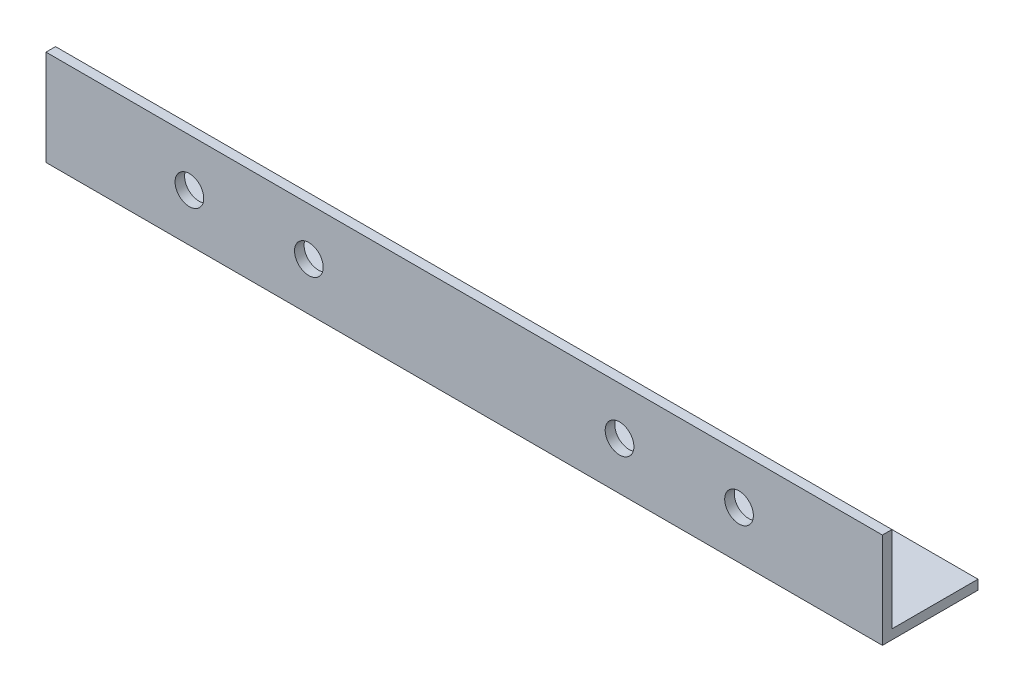
ISO-10303-21;
HEADER;
FILE_DESCRIPTION(('STEP AP214'),'2;1');
FILE_NAME('part.step','',(''),(''),'','','');
FILE_SCHEMA(('AUTOMOTIVE_DESIGN { 1 0 10303 214 1 1 1 1 }'));
ENDSEC;
DATA;
#1=APPLICATION_CONTEXT('core data for automotive mechanical design processes');
#2=APPLICATION_PROTOCOL_DEFINITION('international standard','automotive_design',2000,#1);
#3=PRODUCT_CONTEXT('',#1,'mechanical');
#4=PRODUCT('Part','Part','',(#3));
#5=PRODUCT_RELATED_PRODUCT_CATEGORY('part','',(#4));
#6=PRODUCT_DEFINITION_FORMATION('','',#4);
#7=PRODUCT_DEFINITION_CONTEXT('part definition',#1,'design');
#8=PRODUCT_DEFINITION('design','',#6,#7);
#9=PRODUCT_DEFINITION_SHAPE('','',#8);
#10=(LENGTH_UNIT() NAMED_UNIT(*) SI_UNIT(.MILLI.,.METRE.));
#11=(NAMED_UNIT(*) PLANE_ANGLE_UNIT() SI_UNIT($,.RADIAN.));
#12=(NAMED_UNIT(*) SI_UNIT($,.STERADIAN.) SOLID_ANGLE_UNIT());
#13=UNCERTAINTY_MEASURE_WITH_UNIT(LENGTH_MEASURE(1.E-05),#10,'distance_accuracy_value','');
#14=(GEOMETRIC_REPRESENTATION_CONTEXT(3) GLOBAL_UNCERTAINTY_ASSIGNED_CONTEXT((#13)) GLOBAL_UNIT_ASSIGNED_CONTEXT((#10,
#11,#12)) REPRESENTATION_CONTEXT('',''));
#15=CARTESIAN_POINT('',(0.,0.,0.));
#16=DIRECTION('',(0.,0.,1.));
#17=DIRECTION('',(1.,0.,0.));
#18=AXIS2_PLACEMENT_3D('',#15,#16,#17);
#19=CARTESIAN_POINT('',(350.,0.,-40.));
#20=DIRECTION('',(0.,1.,0.));
#21=DIRECTION('',(0.,0.,1.));
#22=AXIS2_PLACEMENT_3D('',#19,#20,#21);
#23=PLANE('',#22);
#24=DIRECTION('',(0.,0.,-1.));
#25=VECTOR('',#24,1.);
#26=CARTESIAN_POINT('',(0.,0.,-40.));
#27=LINE('',#26,#25);
#28=CARTESIAN_POINT('',(0.,0.,0.));
#29=VERTEX_POINT('',#28);
#30=CARTESIAN_POINT('',(0.,0.,-40.));
#31=VERTEX_POINT('',#30);
#32=EDGE_CURVE('E122',#29,#31,#27,.T.);
#33=ORIENTED_EDGE('',*,*,#32,.T.);
#34=DIRECTION('',(-1.,0.,0.));
#35=VECTOR('',#34,1.);
#36=CARTESIAN_POINT('',(350.,0.,-40.));
#37=LINE('',#36,#35);
#38=CARTESIAN_POINT('',(350.,0.,-40.));
#39=VERTEX_POINT('',#38);
#40=EDGE_CURVE('E11',#39,#31,#37,.T.);
#41=ORIENTED_EDGE('',*,*,#40,.F.);
#42=DIRECTION('',(0.,0.,-1.));
#43=VECTOR('',#42,1.);
#44=CARTESIAN_POINT('',(350.,0.,-40.));
#45=LINE('',#44,#43);
#46=CARTESIAN_POINT('',(350.,0.,0.));
#47=VERTEX_POINT('',#46);
#48=EDGE_CURVE('E133',#47,#39,#45,.T.);
#49=ORIENTED_EDGE('',*,*,#48,.F.);
#50=DIRECTION('',(-1.,0.,0.));
#51=VECTOR('',#50,1.);
#52=CARTESIAN_POINT('',(350.,0.,0.));
#53=LINE('',#52,#51);
#54=EDGE_CURVE('E118',#47,#29,#53,.T.);
#55=ORIENTED_EDGE('',*,*,#54,.T.);
#56=EDGE_LOOP('',(#33,#41,#49,#55));
#57=FACE_BOUND('',#56,.T.);
#58=ADVANCED_FACE('F38',(#57),#23,.F.);
#59=CARTESIAN_POINT('',(350.,4.,-40.));
#60=DIRECTION('',(0.,0.,1.));
#61=DIRECTION('',(1.,0.,0.));
#62=AXIS2_PLACEMENT_3D('',#59,#60,#61);
#63=PLANE('',#62);
#64=DIRECTION('',(0.,1.,0.));
#65=VECTOR('',#64,1.);
#66=CARTESIAN_POINT('',(0.,4.,-40.));
#67=LINE('',#66,#65);
#68=CARTESIAN_POINT('',(0.,4.,-40.));
#69=VERTEX_POINT('',#68);
#70=EDGE_CURVE('E125',#31,#69,#67,.T.);
#71=ORIENTED_EDGE('',*,*,#70,.T.);
#72=DIRECTION('',(-1.,0.,0.));
#73=VECTOR('',#72,1.);
#74=CARTESIAN_POINT('',(350.,4.,-40.));
#75=LINE('',#74,#73);
#76=CARTESIAN_POINT('',(350.,4.,-40.));
#77=VERTEX_POINT('',#76);
#78=EDGE_CURVE('E46',#77,#69,#75,.T.);
#79=ORIENTED_EDGE('',*,*,#78,.F.);
#80=DIRECTION('',(0.,1.,0.));
#81=VECTOR('',#80,1.);
#82=CARTESIAN_POINT('',(350.,4.,-40.));
#83=LINE('',#82,#81);
#84=EDGE_CURVE('E91',#39,#77,#83,.T.);
#85=ORIENTED_EDGE('',*,*,#84,.F.);
#86=ORIENTED_EDGE('',*,*,#40,.T.);
#87=EDGE_LOOP('',(#71,#79,#85,#86));
#88=FACE_BOUND('',#87,.T.);
#89=ADVANCED_FACE('F162',(#88),#63,.F.);
#90=CARTESIAN_POINT('',(350.,4.,-4.));
#91=DIRECTION('',(0.,-1.,0.));
#92=DIRECTION('',(0.,0.,-1.));
#93=AXIS2_PLACEMENT_3D('',#90,#91,#92);
#94=PLANE('',#93);
#95=DIRECTION('',(0.,0.,1.));
#96=VECTOR('',#95,1.);
#97=CARTESIAN_POINT('',(0.,4.,-4.));
#98=LINE('',#97,#96);
#99=CARTESIAN_POINT('',(0.,4.,-4.));
#100=VERTEX_POINT('',#99);
#101=EDGE_CURVE('E128',#69,#100,#98,.T.);
#102=ORIENTED_EDGE('',*,*,#101,.T.);
#103=DIRECTION('',(-1.,0.,0.));
#104=VECTOR('',#103,1.);
#105=CARTESIAN_POINT('',(350.,4.,-4.));
#106=LINE('',#105,#104);
#107=CARTESIAN_POINT('',(350.,4.,-4.));
#108=VERTEX_POINT('',#107);
#109=EDGE_CURVE('E113',#108,#100,#106,.T.);
#110=ORIENTED_EDGE('',*,*,#109,.F.);
#111=DIRECTION('',(0.,0.,1.));
#112=VECTOR('',#111,1.);
#113=CARTESIAN_POINT('',(350.,4.,-4.));
#114=LINE('',#113,#112);
#115=EDGE_CURVE('E104',#77,#108,#114,.T.);
#116=ORIENTED_EDGE('',*,*,#115,.F.);
#117=ORIENTED_EDGE('',*,*,#78,.T.);
#118=EDGE_LOOP('',(#102,#110,#116,#117));
#119=FACE_BOUND('',#118,.T.);
#120=ADVANCED_FACE('F139',(#119),#94,.F.);
#121=CARTESIAN_POINT('',(350.,40.,-4.));
#122=DIRECTION('',(0.,0.,1.));
#123=DIRECTION('',(0.,-1.,0.));
#124=AXIS2_PLACEMENT_3D('',#121,#122,#123);
#125=PLANE('',#124);
#126=CARTESIAN_POINT('',(110.,20.,-4.));
#127=DIRECTION('',(0.,0.,1.));
#128=DIRECTION('',(0.,-1.,0.));
#129=AXIS2_PLACEMENT_3D('',#126,#127,#128);
#130=CIRCLE('',#129,6.);
#131=CARTESIAN_POINT('',(110.,14.,-4.));
#132=VERTEX_POINT('',#131);
#133=EDGE_CURVE('E178',#132,#132,#130,.T.);
#134=ORIENTED_EDGE('',*,*,#133,.T.);
#135=EDGE_LOOP('',(#134));
#136=FACE_BOUND('',#135,.T.);
#137=CARTESIAN_POINT('',(240.,20.,-4.));
#138=DIRECTION('',(0.,0.,1.));
#139=DIRECTION('',(0.,-1.,0.));
#140=AXIS2_PLACEMENT_3D('',#137,#138,#139);
#141=CIRCLE('',#140,6.00000000000002);
#142=CARTESIAN_POINT('',(240.,14.,-4.));
#143=VERTEX_POINT('',#142);
#144=EDGE_CURVE('E182',#143,#143,#141,.T.);
#145=ORIENTED_EDGE('',*,*,#144,.T.);
#146=EDGE_LOOP('',(#145));
#147=FACE_BOUND('',#146,.T.);
#148=CARTESIAN_POINT('',(290.,20.,-4.));
#149=DIRECTION('',(0.,0.,1.));
#150=DIRECTION('',(0.,-1.,0.));
#151=AXIS2_PLACEMENT_3D('',#148,#149,#150);
#152=CIRCLE('',#151,5.99999999999999);
#153=CARTESIAN_POINT('',(290.,14.,-4.));
#154=VERTEX_POINT('',#153);
#155=EDGE_CURVE('E186',#154,#154,#152,.T.);
#156=ORIENTED_EDGE('',*,*,#155,.T.);
#157=EDGE_LOOP('',(#156));
#158=FACE_BOUND('',#157,.T.);
#159=CARTESIAN_POINT('',(60.,20.,-4.));
#160=DIRECTION('',(0.,0.,1.));
#161=DIRECTION('',(0.,-1.,0.));
#162=AXIS2_PLACEMENT_3D('',#159,#160,#161);
#163=CIRCLE('',#162,6.);
#164=CARTESIAN_POINT('',(60.,14.,-4.));
#165=VERTEX_POINT('',#164);
#166=EDGE_CURVE('E126',#165,#165,#163,.T.);
#167=ORIENTED_EDGE('',*,*,#166,.T.);
#168=EDGE_LOOP('',(#167));
#169=FACE_BOUND('',#168,.T.);
#170=DIRECTION('',(0.,1.,0.));
#171=VECTOR('',#170,1.);
#172=CARTESIAN_POINT('',(0.,40.,-4.));
#173=LINE('',#172,#171);
#174=CARTESIAN_POINT('',(0.,40.,-4.));
#175=VERTEX_POINT('',#174);
#176=EDGE_CURVE('E112',#100,#175,#173,.T.);
#177=ORIENTED_EDGE('',*,*,#176,.T.);
#178=DIRECTION('',(-1.,0.,0.));
#179=VECTOR('',#178,1.);
#180=CARTESIAN_POINT('',(350.,40.,-4.));
#181=LINE('',#180,#179);
#182=CARTESIAN_POINT('',(350.,40.,-4.));
#183=VERTEX_POINT('',#182);
#184=EDGE_CURVE('E109',#183,#175,#181,.T.);
#185=ORIENTED_EDGE('',*,*,#184,.F.);
#186=DIRECTION('',(0.,1.,0.));
#187=VECTOR('',#186,1.);
#188=CARTESIAN_POINT('',(350.,40.,-4.));
#189=LINE('',#188,#187);
#190=EDGE_CURVE('E98',#108,#183,#189,.T.);
#191=ORIENTED_EDGE('',*,*,#190,.F.);
#192=ORIENTED_EDGE('',*,*,#109,.T.);
#193=EDGE_LOOP('',(#177,#185,#191,#192));
#194=FACE_BOUND('',#193,.T.);
#195=ADVANCED_FACE('F110',(#136,#147,#158,#169,#194),#125,.F.);
#196=CARTESIAN_POINT('',(350.,40.,0.));
#197=DIRECTION('',(0.,-1.,0.));
#198=DIRECTION('',(0.,0.,-1.));
#199=AXIS2_PLACEMENT_3D('',#196,#197,#198);
#200=PLANE('',#199);
#201=DIRECTION('',(0.,0.,1.));
#202=VECTOR('',#201,1.);
#203=CARTESIAN_POINT('',(0.,40.,0.));
#204=LINE('',#203,#202);
#205=CARTESIAN_POINT('',(0.,40.,0.));
#206=VERTEX_POINT('',#205);
#207=EDGE_CURVE('E77',#175,#206,#204,.T.);
#208=ORIENTED_EDGE('',*,*,#207,.T.);
#209=DIRECTION('',(-1.,0.,0.));
#210=VECTOR('',#209,1.);
#211=CARTESIAN_POINT('',(350.,40.,0.));
#212=LINE('',#211,#210);
#213=CARTESIAN_POINT('',(350.,40.,0.));
#214=VERTEX_POINT('',#213);
#215=EDGE_CURVE('E114',#214,#206,#212,.T.);
#216=ORIENTED_EDGE('',*,*,#215,.F.);
#217=DIRECTION('',(0.,0.,1.));
#218=VECTOR('',#217,1.);
#219=CARTESIAN_POINT('',(350.,40.,0.));
#220=LINE('',#219,#218);
#221=EDGE_CURVE('E102',#183,#214,#220,.T.);
#222=ORIENTED_EDGE('',*,*,#221,.F.);
#223=ORIENTED_EDGE('',*,*,#184,.T.);
#224=EDGE_LOOP('',(#208,#216,#222,#223));
#225=FACE_BOUND('',#224,.T.);
#226=ADVANCED_FACE('F116',(#225),#200,.F.);
#227=CARTESIAN_POINT('',(350.,0.,0.));
#228=DIRECTION('',(0.,0.,-1.));
#229=DIRECTION('',(-1.,0.,0.));
#230=AXIS2_PLACEMENT_3D('',#227,#228,#229);
#231=PLANE('',#230);
#232=CARTESIAN_POINT('',(110.,20.,0.));
#233=DIRECTION('',(0.,0.,1.));
#234=DIRECTION('',(1.,0.,0.));
#235=AXIS2_PLACEMENT_3D('',#232,#233,#234);
#236=CIRCLE('',#235,6.);
#237=CARTESIAN_POINT('',(116.,20.,0.));
#238=VERTEX_POINT('',#237);
#239=EDGE_CURVE('E206',#238,#238,#236,.T.);
#240=ORIENTED_EDGE('',*,*,#239,.F.);
#241=EDGE_LOOP('',(#240));
#242=FACE_BOUND('',#241,.T.);
#243=CARTESIAN_POINT('',(240.,20.,0.));
#244=DIRECTION('',(0.,0.,1.));
#245=DIRECTION('',(1.,0.,0.));
#246=AXIS2_PLACEMENT_3D('',#243,#244,#245);
#247=CIRCLE('',#246,6.00000000000002);
#248=CARTESIAN_POINT('',(246.,20.,0.));
#249=VERTEX_POINT('',#248);
#250=EDGE_CURVE('E202',#249,#249,#247,.T.);
#251=ORIENTED_EDGE('',*,*,#250,.F.);
#252=EDGE_LOOP('',(#251));
#253=FACE_BOUND('',#252,.T.);
#254=CARTESIAN_POINT('',(290.,20.,0.));
#255=DIRECTION('',(0.,0.,1.));
#256=DIRECTION('',(1.,0.,0.));
#257=AXIS2_PLACEMENT_3D('',#254,#255,#256);
#258=CIRCLE('',#257,5.99999999999999);
#259=CARTESIAN_POINT('',(296.,20.,0.));
#260=VERTEX_POINT('',#259);
#261=EDGE_CURVE('E198',#260,#260,#258,.T.);
#262=ORIENTED_EDGE('',*,*,#261,.F.);
#263=EDGE_LOOP('',(#262));
#264=FACE_BOUND('',#263,.T.);
#265=CARTESIAN_POINT('',(60.,20.,0.));
#266=DIRECTION('',(0.,0.,1.));
#267=DIRECTION('',(1.,0.,0.));
#268=AXIS2_PLACEMENT_3D('',#265,#266,#267);
#269=CIRCLE('',#268,6.);
#270=CARTESIAN_POINT('',(66.,20.,0.));
#271=VERTEX_POINT('',#270);
#272=EDGE_CURVE('E190',#271,#271,#269,.T.);
#273=ORIENTED_EDGE('',*,*,#272,.F.);
#274=EDGE_LOOP('',(#273));
#275=FACE_BOUND('',#274,.T.);
#276=DIRECTION('',(0.,-1.,0.));
#277=VECTOR('',#276,1.);
#278=CARTESIAN_POINT('',(0.,0.,0.));
#279=LINE('',#278,#277);
#280=EDGE_CURVE('E83',#206,#29,#279,.T.);
#281=ORIENTED_EDGE('',*,*,#280,.T.);
#282=ORIENTED_EDGE('',*,*,#54,.F.);
#283=DIRECTION('',(0.,-1.,0.));
#284=VECTOR('',#283,1.);
#285=CARTESIAN_POINT('',(350.,0.,0.));
#286=LINE('',#285,#284);
#287=EDGE_CURVE('E54',#214,#47,#286,.T.);
#288=ORIENTED_EDGE('',*,*,#287,.F.);
#289=ORIENTED_EDGE('',*,*,#215,.T.);
#290=EDGE_LOOP('',(#281,#282,#288,#289));
#291=FACE_BOUND('',#290,.T.);
#292=ADVANCED_FACE('F146',(#242,#253,#264,#275,#291),#231,.F.);
#293=CARTESIAN_POINT('',(350.,0.,0.));
#294=DIRECTION('',(-1.,0.,0.));
#295=DIRECTION('',(0.,0.,1.));
#296=AXIS2_PLACEMENT_3D('',#293,#294,#295);
#297=PLANE('',#296);
#298=ORIENTED_EDGE('',*,*,#48,.T.);
#299=ORIENTED_EDGE('',*,*,#84,.T.);
#300=ORIENTED_EDGE('',*,*,#115,.T.);
#301=ORIENTED_EDGE('',*,*,#190,.T.);
#302=ORIENTED_EDGE('',*,*,#221,.T.);
#303=ORIENTED_EDGE('',*,*,#287,.T.);
#304=EDGE_LOOP('',(#298,#299,#300,#301,#302,#303));
#305=FACE_BOUND('',#304,.T.);
#306=ADVANCED_FACE('F100',(#305),#297,.F.);
#307=CARTESIAN_POINT('',(0.,0.,0.));
#308=DIRECTION('',(-1.,0.,0.));
#309=DIRECTION('',(0.,0.,1.));
#310=AXIS2_PLACEMENT_3D('',#307,#308,#309);
#311=PLANE('',#310);
#312=ORIENTED_EDGE('',*,*,#32,.F.);
#313=ORIENTED_EDGE('',*,*,#280,.F.);
#314=ORIENTED_EDGE('',*,*,#207,.F.);
#315=ORIENTED_EDGE('',*,*,#176,.F.);
#316=ORIENTED_EDGE('',*,*,#101,.F.);
#317=ORIENTED_EDGE('',*,*,#70,.F.);
#318=EDGE_LOOP('',(#312,#313,#314,#315,#316,#317));
#319=FACE_BOUND('',#318,.T.);
#320=ADVANCED_FACE('F142',(#319),#311,.T.);
#321=CARTESIAN_POINT('',(60.,20.,-40.));
#322=DIRECTION('',(0.,0.,1.));
#323=DIRECTION('',(1.,0.,0.));
#324=AXIS2_PLACEMENT_3D('',#321,#322,#323);
#325=CYLINDRICAL_SURFACE('',#324,6.);
#326=ORIENTED_EDGE('',*,*,#272,.T.);
#327=EDGE_LOOP('',(#326));
#328=FACE_BOUND('',#327,.T.);
#329=ORIENTED_EDGE('',*,*,#166,.F.);
#330=EDGE_LOOP('',(#329));
#331=FACE_BOUND('',#330,.T.);
#332=ADVANCED_FACE('F222',(#328,#331),#325,.F.);
#333=CARTESIAN_POINT('',(290.,20.,-40.));
#334=DIRECTION('',(0.,0.,1.));
#335=DIRECTION('',(1.,0.,0.));
#336=AXIS2_PLACEMENT_3D('',#333,#334,#335);
#337=CYLINDRICAL_SURFACE('',#336,5.99999999999999);
#338=ORIENTED_EDGE('',*,*,#261,.T.);
#339=EDGE_LOOP('',(#338));
#340=FACE_BOUND('',#339,.T.);
#341=ORIENTED_EDGE('',*,*,#155,.F.);
#342=EDGE_LOOP('',(#341));
#343=FACE_BOUND('',#342,.T.);
#344=ADVANCED_FACE('F216',(#340,#343),#337,.F.);
#345=CARTESIAN_POINT('',(240.,20.,-40.));
#346=DIRECTION('',(0.,0.,1.));
#347=DIRECTION('',(1.,0.,0.));
#348=AXIS2_PLACEMENT_3D('',#345,#346,#347);
#349=CYLINDRICAL_SURFACE('',#348,6.00000000000002);
#350=ORIENTED_EDGE('',*,*,#250,.T.);
#351=EDGE_LOOP('',(#350));
#352=FACE_BOUND('',#351,.T.);
#353=ORIENTED_EDGE('',*,*,#144,.F.);
#354=EDGE_LOOP('',(#353));
#355=FACE_BOUND('',#354,.T.);
#356=ADVANCED_FACE('F212',(#352,#355),#349,.F.);
#357=CARTESIAN_POINT('',(110.,20.,-40.));
#358=DIRECTION('',(0.,0.,1.));
#359=DIRECTION('',(1.,0.,0.));
#360=AXIS2_PLACEMENT_3D('',#357,#358,#359);
#361=CYLINDRICAL_SURFACE('',#360,6.);
#362=ORIENTED_EDGE('',*,*,#239,.T.);
#363=EDGE_LOOP('',(#362));
#364=FACE_BOUND('',#363,.T.);
#365=ORIENTED_EDGE('',*,*,#133,.F.);
#366=EDGE_LOOP('',(#365));
#367=FACE_BOUND('',#366,.T.);
#368=ADVANCED_FACE('F209',(#364,#367),#361,.F.);
#369=CLOSED_SHELL('',(#58,#89,#120,#195,#226,#292,#306,#320,#332,#344,#356,#368));
#370=MANIFOLD_SOLID_BREP('B2',#369);
#371=ADVANCED_BREP_SHAPE_REPRESENTATION('',(#18,#370),#14);
#372=SHAPE_DEFINITION_REPRESENTATION(#9,#371);
ENDSEC;
END-ISO-10303-21;
